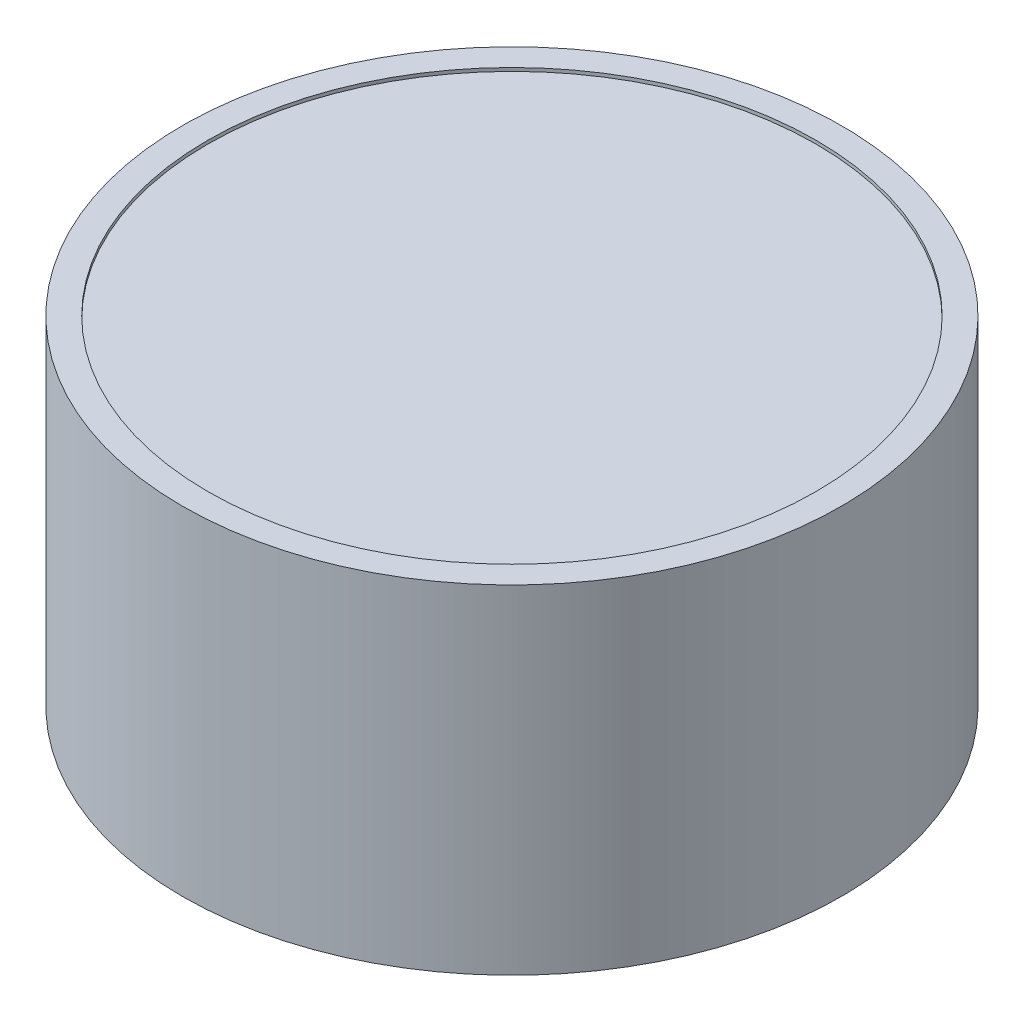
ISO-10303-21;
HEADER;
FILE_DESCRIPTION(('STEP AP214'),'2;1');
FILE_NAME('part.step','',(''),(''),'','','');
FILE_SCHEMA(('AUTOMOTIVE_DESIGN { 1 0 10303 214 1 1 1 1 }'));
ENDSEC;
DATA;
#1=APPLICATION_CONTEXT('core data for automotive mechanical design processes');
#2=APPLICATION_PROTOCOL_DEFINITION('international standard','automotive_design',2000,#1);
#3=PRODUCT_CONTEXT('',#1,'mechanical');
#4=PRODUCT('Part','Part','',(#3));
#5=PRODUCT_RELATED_PRODUCT_CATEGORY('part','',(#4));
#6=PRODUCT_DEFINITION_FORMATION('','',#4);
#7=PRODUCT_DEFINITION_CONTEXT('part definition',#1,'design');
#8=PRODUCT_DEFINITION('design','',#6,#7);
#9=PRODUCT_DEFINITION_SHAPE('','',#8);
#10=(LENGTH_UNIT() NAMED_UNIT(*) SI_UNIT(.MILLI.,.METRE.));
#11=(NAMED_UNIT(*) PLANE_ANGLE_UNIT() SI_UNIT($,.RADIAN.));
#12=(NAMED_UNIT(*) SI_UNIT($,.STERADIAN.) SOLID_ANGLE_UNIT());
#13=UNCERTAINTY_MEASURE_WITH_UNIT(LENGTH_MEASURE(1.E-05),#10,'distance_accuracy_value','');
#14=(GEOMETRIC_REPRESENTATION_CONTEXT(3) GLOBAL_UNCERTAINTY_ASSIGNED_CONTEXT((#13)) GLOBAL_UNIT_ASSIGNED_CONTEXT((#10,
#11,#12)) REPRESENTATION_CONTEXT('',''));
#15=CARTESIAN_POINT('',(0.,0.,0.));
#16=DIRECTION('',(0.,0.,1.));
#17=DIRECTION('',(1.,0.,0.));
#18=AXIS2_PLACEMENT_3D('',#15,#16,#17);
#19=CARTESIAN_POINT('',(0.,5.,0.));
#20=DIRECTION('',(0.,-1.,0.));
#21=DIRECTION('',(0.,0.,-1.));
#22=AXIS2_PLACEMENT_3D('',#19,#20,#21);
#23=CYLINDRICAL_SURFACE('',#22,4.875);
#24=CARTESIAN_POINT('',(0.,5.,0.));
#25=DIRECTION('',(0.,1.,0.));
#26=DIRECTION('',(0.,0.,1.));
#27=AXIS2_PLACEMENT_3D('',#24,#25,#26);
#28=CIRCLE('',#27,4.875);
#29=CARTESIAN_POINT('',(0.,5.,4.875));
#30=VERTEX_POINT('',#29);
#31=EDGE_CURVE('E10',#30,#30,#28,.T.);
#32=ORIENTED_EDGE('',*,*,#31,.F.);
#33=EDGE_LOOP('',(#32));
#34=FACE_BOUND('',#33,.T.);
#35=CARTESIAN_POINT('',(0.,0.,0.));
#36=DIRECTION('',(0.,1.,0.));
#37=DIRECTION('',(0.,0.,1.));
#38=AXIS2_PLACEMENT_3D('',#35,#36,#37);
#39=CIRCLE('',#38,4.875);
#40=CARTESIAN_POINT('',(0.,0.,4.875));
#41=VERTEX_POINT('',#40);
#42=EDGE_CURVE('E36',#41,#41,#39,.T.);
#43=ORIENTED_EDGE('',*,*,#42,.T.);
#44=EDGE_LOOP('',(#43));
#45=FACE_BOUND('',#44,.T.);
#46=ADVANCED_FACE('F33',(#34,#45),#23,.T.);
#47=CARTESIAN_POINT('',(0.,5.,0.));
#48=DIRECTION('',(0.,1.,0.));
#49=DIRECTION('',(0.,0.,1.));
#50=AXIS2_PLACEMENT_3D('',#47,#48,#49);
#51=PLANE('',#50);
#52=CARTESIAN_POINT('',(0.,5.,0.));
#53=DIRECTION('',(0.,1.,0.));
#54=DIRECTION('',(0.,0.,1.));
#55=AXIS2_PLACEMENT_3D('',#52,#53,#54);
#56=CIRCLE('',#55,4.5);
#57=CARTESIAN_POINT('',(0.,5.,4.5));
#58=VERTEX_POINT('',#57);
#59=EDGE_CURVE('E43',#58,#58,#56,.T.);
#60=ORIENTED_EDGE('',*,*,#59,.F.);
#61=EDGE_LOOP('',(#60));
#62=FACE_BOUND('',#61,.T.);
#63=ORIENTED_EDGE('',*,*,#31,.T.);
#64=EDGE_LOOP('',(#63));
#65=FACE_BOUND('',#64,.T.);
#66=ADVANCED_FACE('F60',(#62,#65),#51,.T.);
#67=CARTESIAN_POINT('',(0.,0.,0.));
#68=DIRECTION('',(0.,1.,0.));
#69=DIRECTION('',(0.,0.,1.));
#70=AXIS2_PLACEMENT_3D('',#67,#68,#69);
#71=PLANE('',#70);
#72=ORIENTED_EDGE('',*,*,#42,.F.);
#73=EDGE_LOOP('',(#72));
#74=FACE_BOUND('',#73,.T.);
#75=ADVANCED_FACE('F56',(#74),#71,.F.);
#76=CARTESIAN_POINT('',(0.,4.,0.));
#77=DIRECTION('',(0.,1.,0.));
#78=DIRECTION('',(0.,0.,1.));
#79=AXIS2_PLACEMENT_3D('',#76,#77,#78);
#80=CYLINDRICAL_SURFACE('',#79,4.5);
#81=CARTESIAN_POINT('',(0.,4.95,0.));
#82=DIRECTION('',(0.,1.,0.));
#83=DIRECTION('',(0.,0.,1.));
#84=AXIS2_PLACEMENT_3D('',#81,#82,#83);
#85=CIRCLE('',#84,4.5);
#86=CARTESIAN_POINT('',(0.,4.95,4.5));
#87=VERTEX_POINT('',#86);
#88=EDGE_CURVE('E47',#87,#87,#85,.T.);
#89=ORIENTED_EDGE('',*,*,#88,.F.);
#90=EDGE_LOOP('',(#89));
#91=FACE_BOUND('',#90,.T.);
#92=ORIENTED_EDGE('',*,*,#59,.T.);
#93=EDGE_LOOP('',(#92));
#94=FACE_BOUND('',#93,.T.);
#95=ADVANCED_FACE('F53',(#91,#94),#80,.F.);
#96=CARTESIAN_POINT('',(0.,4.95,0.));
#97=DIRECTION('',(0.,1.,0.));
#98=DIRECTION('',(0.,0.,1.));
#99=AXIS2_PLACEMENT_3D('',#96,#97,#98);
#100=PLANE('',#99);
#101=ORIENTED_EDGE('',*,*,#88,.T.);
#102=EDGE_LOOP('',(#101));
#103=FACE_BOUND('',#102,.T.);
#104=ADVANCED_FACE('F51',(#103),#100,.T.);
#105=CLOSED_SHELL('',(#46,#66,#75,#95,#104));
#106=MANIFOLD_SOLID_BREP('B2',#105);
#107=ADVANCED_BREP_SHAPE_REPRESENTATION('',(#18,#106),#14);
#108=SHAPE_DEFINITION_REPRESENTATION(#9,#107);
ENDSEC;
END-ISO-10303-21;
